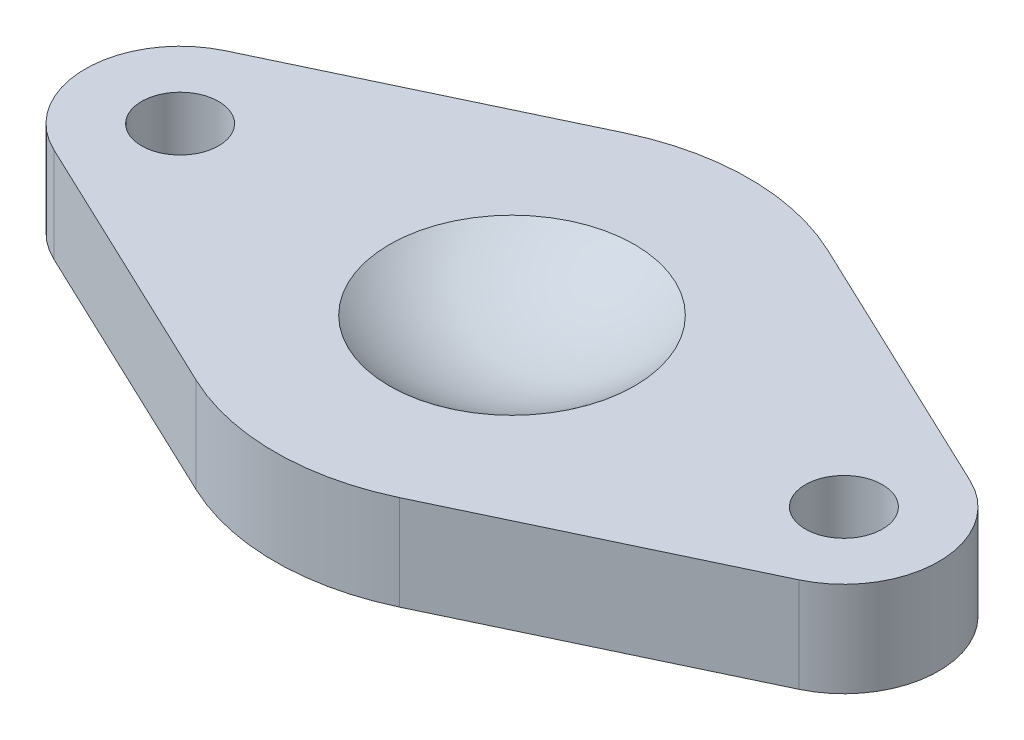
ISO-10303-21;
HEADER;
FILE_DESCRIPTION(('STEP AP214'),'2;1');
FILE_NAME('part.step','',(''),(''),'','','');
FILE_SCHEMA(('AUTOMOTIVE_DESIGN { 1 0 10303 214 1 1 1 1 }'));
ENDSEC;
DATA;
#1=APPLICATION_CONTEXT('core data for automotive mechanical design processes');
#2=APPLICATION_PROTOCOL_DEFINITION('international standard','automotive_design',2000,#1);
#3=PRODUCT_CONTEXT('',#1,'mechanical');
#4=PRODUCT('Part','Part','',(#3));
#5=PRODUCT_RELATED_PRODUCT_CATEGORY('part','',(#4));
#6=PRODUCT_DEFINITION_FORMATION('','',#4);
#7=PRODUCT_DEFINITION_CONTEXT('part definition',#1,'design');
#8=PRODUCT_DEFINITION('design','',#6,#7);
#9=PRODUCT_DEFINITION_SHAPE('','',#8);
#10=(LENGTH_UNIT() NAMED_UNIT(*) SI_UNIT(.MILLI.,.METRE.));
#11=(NAMED_UNIT(*) PLANE_ANGLE_UNIT() SI_UNIT($,.RADIAN.));
#12=(NAMED_UNIT(*) SI_UNIT($,.STERADIAN.) SOLID_ANGLE_UNIT());
#13=UNCERTAINTY_MEASURE_WITH_UNIT(LENGTH_MEASURE(1.E-05),#10,'distance_accuracy_value','');
#14=(GEOMETRIC_REPRESENTATION_CONTEXT(3) GLOBAL_UNCERTAINTY_ASSIGNED_CONTEXT((#13)) GLOBAL_UNIT_ASSIGNED_CONTEXT((#10,
#11,#12)) REPRESENTATION_CONTEXT('',''));
#15=CARTESIAN_POINT('',(0.,0.,0.));
#16=DIRECTION('',(0.,0.,1.));
#17=DIRECTION('',(1.,0.,0.));
#18=AXIS2_PLACEMENT_3D('',#15,#16,#17);
#19=CARTESIAN_POINT('',(0.,4.,0.));
#20=DIRECTION('',(0.,-1.,0.));
#21=DIRECTION('',(0.,0.,-1.));
#22=AXIS2_PLACEMENT_3D('',#19,#20,#21);
#23=PLANE('',#22);
#24=DIRECTION('',(-0.903507893904257,0.,0.42857144754719));
#25=VECTOR('',#24,1.);
#26=CARTESIAN_POINT('',(0.355455076823366,4.,0.749365058443128));
#27=LINE('',#26,#25);
#28=CARTESIAN_POINT('',(15.7142857142874,4.,-6.53596838838076));
#29=VERTEX_POINT('',#28);
#30=CARTESIAN_POINT('',(4.28571428571024,4.,-1.11492067691406));
#31=VERTEX_POINT('',#30);
#32=EDGE_CURVE('E173',#29,#31,#27,.T.);
#33=ORIENTED_EDGE('',*,*,#32,.F.);
#34=CARTESIAN_POINT('',(13.9999999999999,4.,-10.15));
#35=DIRECTION('',(0.,1.,0.));
#36=DIRECTION('',(0.,0.,1.));
#37=AXIS2_PLACEMENT_3D('',#34,#35,#36);
#38=CIRCLE('',#37,3.99999999999785);
#39=CARTESIAN_POINT('',(15.7142857142862,4.,-13.7640316116169));
#40=VERTEX_POINT('',#39);
#41=EDGE_CURVE('E209',#40,#29,#38,.F.);
#42=ORIENTED_EDGE('',*,*,#41,.F.);
#43=DIRECTION('',(-0.903507911905861,0.,-0.428571409596477));
#44=VECTOR('',#43,1.);
#45=CARTESIAN_POINT('',(8.21597322489227,4.,-17.3207933298355));
#46=LINE('',#45,#44);
#47=CARTESIAN_POINT('',(4.28571428572078,4.,-19.1850787350257));
#48=VERTEX_POINT('',#47);
#49=EDGE_CURVE('E206',#40,#48,#46,.T.);
#50=ORIENTED_EDGE('',*,*,#49,.T.);
#51=CARTESIAN_POINT('',(0.,4.,-10.1499997059724));
#52=DIRECTION('',(0.,1.,0.));
#53=DIRECTION('',(0.,0.,1.));
#54=AXIS2_PLACEMENT_3D('',#51,#52,#53);
#55=CIRCLE('',#54,10.0000000000035);
#56=CARTESIAN_POINT('',(-4.28571409596626,4.,-19.1850788250341));
#57=VERTEX_POINT('',#56);
#58=EDGE_CURVE('E178',#48,#57,#55,.T.);
#59=ORIENTED_EDGE('',*,*,#58,.T.);
#60=DIRECTION('',(0.903507911905861,0.,-0.428571409596477));
#61=VECTOR('',#60,1.);
#62=CARTESIAN_POINT('',(-8.21597322489226,4.,-17.3207933298355));
#63=LINE('',#62,#61);
#64=CARTESIAN_POINT('',(-15.7142856383844,4.,-13.7640316476203));
#65=VERTEX_POINT('',#64);
#66=EDGE_CURVE('E194',#65,#57,#63,.T.);
#67=ORIENTED_EDGE('',*,*,#66,.F.);
#68=CARTESIAN_POINT('',(-14.,4.,-10.15));
#69=DIRECTION('',(0.,1.,0.));
#70=DIRECTION('',(0.,0.,1.));
#71=AXIS2_PLACEMENT_3D('',#68,#69,#70);
#72=CIRCLE('',#71,3.99999999999456);
#73=CARTESIAN_POINT('',(-15.7142857142829,4.,-6.53596838838583));
#74=VERTEX_POINT('',#73);
#75=EDGE_CURVE('E211',#65,#74,#72,.T.);
#76=ORIENTED_EDGE('',*,*,#75,.T.);
#77=DIRECTION('',(0.903507893904036,0.,0.428571447547656));
#78=VECTOR('',#77,1.);
#79=CARTESIAN_POINT('',(-0.355455076824717,4.,0.749365058444976));
#80=LINE('',#79,#78);
#81=CARTESIAN_POINT('',(-4.28571428571665,4.,-1.1149206769171));
#82=VERTEX_POINT('',#81);
#83=EDGE_CURVE('E183',#74,#82,#80,.T.);
#84=ORIENTED_EDGE('',*,*,#83,.T.);
#85=CARTESIAN_POINT('',(0.,4.,-10.1499997059724));
#86=DIRECTION('',(0.,1.,0.));
#87=DIRECTION('',(0.,0.,1.));
#88=AXIS2_PLACEMENT_3D('',#85,#86,#87);
#89=CIRCLE('',#88,10.0000000000035);
#90=EDGE_CURVE('E161',#82,#31,#89,.T.);
#91=ORIENTED_EDGE('',*,*,#90,.T.);
#92=EDGE_LOOP('',(#33,#42,#50,#59,#67,#76,#84,#91));
#93=FACE_BOUND('',#92,.T.);
#94=CARTESIAN_POINT('',(13.9999999999999,4.,-10.15));
#95=DIRECTION('',(0.,1.,0.));
#96=DIRECTION('',(0.,0.,-1.));
#97=AXIS2_PLACEMENT_3D('',#94,#95,#96);
#98=CIRCLE('',#97,1.625);
#99=CARTESIAN_POINT('',(13.9999999999999,4.,-11.775));
#100=VERTEX_POINT('',#99);
#101=EDGE_CURVE('E219',#100,#100,#98,.T.);
#102=ORIENTED_EDGE('',*,*,#101,.F.);
#103=EDGE_LOOP('',(#102));
#104=FACE_BOUND('',#103,.T.);
#105=CARTESIAN_POINT('',(-14.,4.,-10.15));
#106=DIRECTION('',(0.,1.,0.));
#107=DIRECTION('',(0.,0.,1.));
#108=AXIS2_PLACEMENT_3D('',#105,#106,#107);
#109=CIRCLE('',#108,1.625);
#110=CARTESIAN_POINT('',(-14.,4.,-8.525));
#111=VERTEX_POINT('',#110);
#112=EDGE_CURVE('E12',#111,#111,#109,.T.);
#113=ORIENTED_EDGE('',*,*,#112,.F.);
#114=EDGE_LOOP('',(#113));
#115=FACE_BOUND('',#114,.T.);
#116=CARTESIAN_POINT('',(0.,4.,-10.1499999999979));
#117=DIRECTION('',(0.,-1.,0.));
#118=DIRECTION('',(0.,0.,-1.));
#119=AXIS2_PLACEMENT_3D('',#116,#117,#118);
#120=CIRCLE('',#119,5.17034815075352);
#121=CARTESIAN_POINT('',(0.,4.,-15.3203481507515));
#122=VERTEX_POINT('',#121);
#123=EDGE_CURVE('E86',#122,#122,#120,.F.);
#124=ORIENTED_EDGE('',*,*,#123,.F.);
#125=EDGE_LOOP('',(#124));
#126=FACE_BOUND('',#125,.T.);
#127=ADVANCED_FACE('F82',(#93,#104,#115,#126),#23,.F.);
#128=CARTESIAN_POINT('',(0.,0.,0.));
#129=DIRECTION('',(0.,-1.,0.));
#130=DIRECTION('',(0.,0.,-1.));
#131=AXIS2_PLACEMENT_3D('',#128,#129,#130);
#132=PLANE('',#131);
#133=CARTESIAN_POINT('',(13.9999999999999,0.,-10.15));
#134=DIRECTION('',(0.,1.,0.));
#135=DIRECTION('',(0.,0.,1.));
#136=AXIS2_PLACEMENT_3D('',#133,#134,#135);
#137=CIRCLE('',#136,3.99999999999785);
#138=CARTESIAN_POINT('',(15.7142857142862,0.,-13.7640316116169));
#139=VERTEX_POINT('',#138);
#140=CARTESIAN_POINT('',(15.7142857142874,0.,-6.53596838838076));
#141=VERTEX_POINT('',#140);
#142=EDGE_CURVE('E196',#139,#141,#137,.F.);
#143=ORIENTED_EDGE('',*,*,#142,.T.);
#144=DIRECTION('',(-0.903507893904257,0.,0.42857144754719));
#145=VECTOR('',#144,1.);
#146=CARTESIAN_POINT('',(0.355455076823366,0.,0.749365058443128));
#147=LINE('',#146,#145);
#148=CARTESIAN_POINT('',(4.28571428571024,0.,-1.11492067691406));
#149=VERTEX_POINT('',#148);
#150=EDGE_CURVE('E169',#141,#149,#147,.T.);
#151=ORIENTED_EDGE('',*,*,#150,.T.);
#152=CARTESIAN_POINT('',(0.,0.,-10.1499997059724));
#153=DIRECTION('',(0.,1.,0.));
#154=DIRECTION('',(0.,0.,1.));
#155=AXIS2_PLACEMENT_3D('',#152,#153,#154);
#156=CIRCLE('',#155,10.0000000000035);
#157=CARTESIAN_POINT('',(-4.28571428571665,0.,-1.1149206769171));
#158=VERTEX_POINT('',#157);
#159=EDGE_CURVE('E164',#158,#149,#156,.T.);
#160=ORIENTED_EDGE('',*,*,#159,.F.);
#161=DIRECTION('',(0.903507893904036,0.,0.428571447547656));
#162=VECTOR('',#161,1.);
#163=CARTESIAN_POINT('',(-0.355455076824717,0.,0.749365058444976));
#164=LINE('',#163,#162);
#165=CARTESIAN_POINT('',(-15.7142857142829,0.,-6.53596838838583));
#166=VERTEX_POINT('',#165);
#167=EDGE_CURVE('E179',#166,#158,#164,.T.);
#168=ORIENTED_EDGE('',*,*,#167,.F.);
#169=CARTESIAN_POINT('',(-14.,0.,-10.15));
#170=DIRECTION('',(0.,1.,0.));
#171=DIRECTION('',(0.,0.,1.));
#172=AXIS2_PLACEMENT_3D('',#169,#170,#171);
#173=CIRCLE('',#172,3.99999999999456);
#174=CARTESIAN_POINT('',(-15.7142856383844,0.,-13.7640316476203));
#175=VERTEX_POINT('',#174);
#176=EDGE_CURVE('E198',#175,#166,#173,.T.);
#177=ORIENTED_EDGE('',*,*,#176,.F.);
#178=DIRECTION('',(0.903507911905861,0.,-0.428571409596477));
#179=VECTOR('',#178,1.);
#180=CARTESIAN_POINT('',(-8.21597322489226,0.,-17.3207933298355));
#181=LINE('',#180,#179);
#182=CARTESIAN_POINT('',(-4.28571409596626,0.,-19.1850788250341));
#183=VERTEX_POINT('',#182);
#184=EDGE_CURVE('E200',#175,#183,#181,.T.);
#185=ORIENTED_EDGE('',*,*,#184,.T.);
#186=CARTESIAN_POINT('',(0.,0.,-10.1499997059724));
#187=DIRECTION('',(0.,1.,0.));
#188=DIRECTION('',(0.,0.,1.));
#189=AXIS2_PLACEMENT_3D('',#186,#187,#188);
#190=CIRCLE('',#189,10.0000000000035);
#191=CARTESIAN_POINT('',(4.28571428572078,0.,-19.1850787350257));
#192=VERTEX_POINT('',#191);
#193=EDGE_CURVE('E101',#192,#183,#190,.T.);
#194=ORIENTED_EDGE('',*,*,#193,.F.);
#195=DIRECTION('',(-0.903507911905861,0.,-0.428571409596477));
#196=VECTOR('',#195,1.);
#197=CARTESIAN_POINT('',(8.21597322489227,0.,-17.3207933298355));
#198=LINE('',#197,#196);
#199=EDGE_CURVE('E129',#139,#192,#198,.T.);
#200=ORIENTED_EDGE('',*,*,#199,.F.);
#201=EDGE_LOOP('',(#143,#151,#160,#168,#177,#185,#194,#200));
#202=FACE_BOUND('',#201,.T.);
#203=CARTESIAN_POINT('',(-14.,0.,-10.15));
#204=DIRECTION('',(0.,1.,0.));
#205=DIRECTION('',(0.,0.,1.));
#206=AXIS2_PLACEMENT_3D('',#203,#204,#205);
#207=CIRCLE('',#206,1.625);
#208=CARTESIAN_POINT('',(-14.,0.,-8.525));
#209=VERTEX_POINT('',#208);
#210=EDGE_CURVE('E92',#209,#209,#207,.T.);
#211=ORIENTED_EDGE('',*,*,#210,.T.);
#212=EDGE_LOOP('',(#211));
#213=FACE_BOUND('',#212,.T.);
#214=CARTESIAN_POINT('',(13.9999999999999,0.,-10.15));
#215=DIRECTION('',(0.,1.,0.));
#216=DIRECTION('',(0.,0.,-1.));
#217=AXIS2_PLACEMENT_3D('',#214,#215,#216);
#218=CIRCLE('',#217,1.625);
#219=CARTESIAN_POINT('',(13.9999999999999,0.,-11.775));
#220=VERTEX_POINT('',#219);
#221=EDGE_CURVE('E222',#220,#220,#218,.T.);
#222=ORIENTED_EDGE('',*,*,#221,.T.);
#223=EDGE_LOOP('',(#222));
#224=FACE_BOUND('',#223,.T.);
#225=ADVANCED_FACE('F84',(#202,#213,#224),#132,.T.);
#226=CARTESIAN_POINT('',(-14.,4.,-10.15));
#227=DIRECTION('',(0.,-1.,0.));
#228=DIRECTION('',(0.,0.,-1.));
#229=AXIS2_PLACEMENT_3D('',#226,#227,#228);
#230=CYLINDRICAL_SURFACE('',#229,1.625);
#231=ORIENTED_EDGE('',*,*,#112,.T.);
#232=EDGE_LOOP('',(#231));
#233=FACE_BOUND('',#232,.T.);
#234=ORIENTED_EDGE('',*,*,#210,.F.);
#235=EDGE_LOOP('',(#234));
#236=FACE_BOUND('',#235,.T.);
#237=ADVANCED_FACE('F229',(#233,#236),#230,.F.);
#238=CARTESIAN_POINT('',(13.9999999999999,4.,-10.15));
#239=DIRECTION('',(0.,-1.,0.));
#240=DIRECTION('',(0.,0.,-1.));
#241=AXIS2_PLACEMENT_3D('',#238,#239,#240);
#242=CYLINDRICAL_SURFACE('',#241,1.625);
#243=ORIENTED_EDGE('',*,*,#101,.T.);
#244=EDGE_LOOP('',(#243));
#245=FACE_BOUND('',#244,.T.);
#246=ORIENTED_EDGE('',*,*,#221,.F.);
#247=EDGE_LOOP('',(#246));
#248=FACE_BOUND('',#247,.T.);
#249=ADVANCED_FACE('F231',(#245,#248),#242,.F.);
#250=CARTESIAN_POINT('',(0.,10.3,-10.1499999999979));
#251=DIRECTION('',(0.,-1.,0.));
#252=DIRECTION('',(1.,0.,0.));
#253=AXIS2_PLACEMENT_3D('',#250,#251,#252);
#254=SPHERICAL_SURFACE('',#253,8.15);
#255=ORIENTED_EDGE('',*,*,#123,.T.);
#256=EDGE_LOOP('',(#255));
#257=FACE_BOUND('',#256,.T.);
#258=ADVANCED_FACE('F238',(#257),#254,.F.);
#259=CARTESIAN_POINT('',(0.,0.,-10.1499997059724));
#260=DIRECTION('',(0.,1.,0.));
#261=DIRECTION('',(0.,0.,1.));
#262=AXIS2_PLACEMENT_3D('',#259,#260,#261);
#263=CYLINDRICAL_SURFACE('',#262,10.0000000000035);
#264=ORIENTED_EDGE('',*,*,#58,.F.);
#265=DIRECTION('',(0.,1.,0.));
#266=VECTOR('',#265,1.);
#267=CARTESIAN_POINT('',(4.28571428572078,0.,-19.1850787350257));
#268=LINE('',#267,#266);
#269=EDGE_CURVE('E203',#192,#48,#268,.T.);
#270=ORIENTED_EDGE('',*,*,#269,.F.);
#271=ORIENTED_EDGE('',*,*,#193,.T.);
#272=DIRECTION('',(0.,1.,0.));
#273=VECTOR('',#272,1.);
#274=CARTESIAN_POINT('',(-4.28571409596626,0.,-19.1850788250341));
#275=LINE('',#274,#273);
#276=EDGE_CURVE('E123',#183,#57,#275,.T.);
#277=ORIENTED_EDGE('',*,*,#276,.T.);
#278=EDGE_LOOP('',(#264,#270,#271,#277));
#279=FACE_BOUND('',#278,.T.);
#280=ADVANCED_FACE('F256',(#279),#263,.T.);
#281=CARTESIAN_POINT('',(-8.21597322489226,0.,-17.3207933298355));
#282=DIRECTION('',(0.428571409596477,0.,0.903507911905861));
#283=DIRECTION('',(0.903507911905861,0.,-0.428571409596477));
#284=AXIS2_PLACEMENT_3D('',#281,#282,#283);
#285=PLANE('',#284);
#286=ORIENTED_EDGE('',*,*,#66,.T.);
#287=ORIENTED_EDGE('',*,*,#276,.F.);
#288=ORIENTED_EDGE('',*,*,#184,.F.);
#289=DIRECTION('',(0.,1.,0.));
#290=VECTOR('',#289,1.);
#291=CARTESIAN_POINT('',(-15.7142856383844,0.,-13.7640316476203));
#292=LINE('',#291,#290);
#293=EDGE_CURVE('E119',#175,#65,#292,.T.);
#294=ORIENTED_EDGE('',*,*,#293,.T.);
#295=EDGE_LOOP('',(#286,#287,#288,#294));
#296=FACE_BOUND('',#295,.T.);
#297=ADVANCED_FACE('F261',(#296),#285,.F.);
#298=CARTESIAN_POINT('',(-14.,0.,-10.15));
#299=DIRECTION('',(0.,1.,0.));
#300=DIRECTION('',(0.,0.,1.));
#301=AXIS2_PLACEMENT_3D('',#298,#299,#300);
#302=CYLINDRICAL_SURFACE('',#301,3.99999999999456);
#303=ORIENTED_EDGE('',*,*,#75,.F.);
#304=ORIENTED_EDGE('',*,*,#293,.F.);
#305=ORIENTED_EDGE('',*,*,#176,.T.);
#306=DIRECTION('',(0.,1.,0.));
#307=VECTOR('',#306,1.);
#308=CARTESIAN_POINT('',(-15.7142857142829,0.,-6.53596838838583));
#309=LINE('',#308,#307);
#310=EDGE_CURVE('E192',#166,#74,#309,.T.);
#311=ORIENTED_EDGE('',*,*,#310,.T.);
#312=EDGE_LOOP('',(#303,#304,#305,#311));
#313=FACE_BOUND('',#312,.T.);
#314=ADVANCED_FACE('F271',(#313),#302,.T.);
#315=CARTESIAN_POINT('',(13.9999999999999,0.,-10.15));
#316=DIRECTION('',(0.,1.,0.));
#317=DIRECTION('',(0.,0.,1.));
#318=AXIS2_PLACEMENT_3D('',#315,#316,#317);
#319=CYLINDRICAL_SURFACE('',#318,3.99999999999785);
#320=ORIENTED_EDGE('',*,*,#41,.T.);
#321=DIRECTION('',(0.,1.,0.));
#322=VECTOR('',#321,1.);
#323=CARTESIAN_POINT('',(15.7142857142874,0.,-6.53596838838076));
#324=LINE('',#323,#322);
#325=EDGE_CURVE('E168',#141,#29,#324,.T.);
#326=ORIENTED_EDGE('',*,*,#325,.F.);
#327=ORIENTED_EDGE('',*,*,#142,.F.);
#328=DIRECTION('',(0.,1.,0.));
#329=VECTOR('',#328,1.);
#330=CARTESIAN_POINT('',(15.7142857142862,0.,-13.7640316116169));
#331=LINE('',#330,#329);
#332=EDGE_CURVE('E216',#139,#40,#331,.T.);
#333=ORIENTED_EDGE('',*,*,#332,.T.);
#334=EDGE_LOOP('',(#320,#326,#327,#333));
#335=FACE_BOUND('',#334,.T.);
#336=ADVANCED_FACE('F281',(#335),#319,.T.);
#337=CARTESIAN_POINT('',(8.21597322489227,0.,-17.3207933298355));
#338=DIRECTION('',(0.428571409596477,0.,-0.903507911905861));
#339=DIRECTION('',(-0.903507911905861,0.,-0.428571409596477));
#340=AXIS2_PLACEMENT_3D('',#337,#338,#339);
#341=PLANE('',#340);
#342=ORIENTED_EDGE('',*,*,#49,.F.);
#343=ORIENTED_EDGE('',*,*,#332,.F.);
#344=ORIENTED_EDGE('',*,*,#199,.T.);
#345=ORIENTED_EDGE('',*,*,#269,.T.);
#346=EDGE_LOOP('',(#342,#343,#344,#345));
#347=FACE_BOUND('',#346,.T.);
#348=ADVANCED_FACE('F292',(#347),#341,.T.);
#349=CARTESIAN_POINT('',(0.,0.,-10.1499997059724));
#350=DIRECTION('',(0.,1.,0.));
#351=DIRECTION('',(0.,0.,1.));
#352=AXIS2_PLACEMENT_3D('',#349,#350,#351);
#353=CYLINDRICAL_SURFACE('',#352,10.0000000000035);
#354=ORIENTED_EDGE('',*,*,#90,.F.);
#355=DIRECTION('',(0.,1.,0.));
#356=VECTOR('',#355,1.);
#357=CARTESIAN_POINT('',(-4.28571428571665,0.,-1.1149206769171));
#358=LINE('',#357,#356);
#359=EDGE_CURVE('E184',#158,#82,#358,.T.);
#360=ORIENTED_EDGE('',*,*,#359,.F.);
#361=ORIENTED_EDGE('',*,*,#159,.T.);
#362=DIRECTION('',(0.,1.,0.));
#363=VECTOR('',#362,1.);
#364=CARTESIAN_POINT('',(4.28571428571024,0.,-1.11492067691406));
#365=LINE('',#364,#363);
#366=EDGE_CURVE('E156',#149,#31,#365,.T.);
#367=ORIENTED_EDGE('',*,*,#366,.T.);
#368=EDGE_LOOP('',(#354,#360,#361,#367));
#369=FACE_BOUND('',#368,.T.);
#370=ADVANCED_FACE('F158',(#369),#353,.T.);
#371=CARTESIAN_POINT('',(0.355455076823366,0.,0.749365058443128));
#372=DIRECTION('',(-0.42857144754719,0.,-0.903507893904257));
#373=DIRECTION('',(-0.903507893904257,0.,0.42857144754719));
#374=AXIS2_PLACEMENT_3D('',#371,#372,#373);
#375=PLANE('',#374);
#376=ORIENTED_EDGE('',*,*,#32,.T.);
#377=ORIENTED_EDGE('',*,*,#366,.F.);
#378=ORIENTED_EDGE('',*,*,#150,.F.);
#379=ORIENTED_EDGE('',*,*,#325,.T.);
#380=EDGE_LOOP('',(#376,#377,#378,#379));
#381=FACE_BOUND('',#380,.T.);
#382=ADVANCED_FACE('F174',(#381),#375,.F.);
#383=CARTESIAN_POINT('',(-0.355455076824717,0.,0.749365058444976));
#384=DIRECTION('',(-0.428571447547656,0.,0.903507893904036));
#385=DIRECTION('',(0.903507893904036,0.,0.428571447547656));
#386=AXIS2_PLACEMENT_3D('',#383,#384,#385);
#387=PLANE('',#386);
#388=ORIENTED_EDGE('',*,*,#83,.F.);
#389=ORIENTED_EDGE('',*,*,#310,.F.);
#390=ORIENTED_EDGE('',*,*,#167,.T.);
#391=ORIENTED_EDGE('',*,*,#359,.T.);
#392=EDGE_LOOP('',(#388,#389,#390,#391));
#393=FACE_BOUND('',#392,.T.);
#394=ADVANCED_FACE('F318',(#393),#387,.T.);
#395=CLOSED_SHELL('',(#127,#225,#237,#249,#258,#280,#297,#314,#336,#348,#370,#382,#394));
#396=MANIFOLD_SOLID_BREP('B2',#395);
#397=ADVANCED_BREP_SHAPE_REPRESENTATION('',(#18,#396),#14);
#398=SHAPE_DEFINITION_REPRESENTATION(#9,#397);
ENDSEC;
END-ISO-10303-21;
